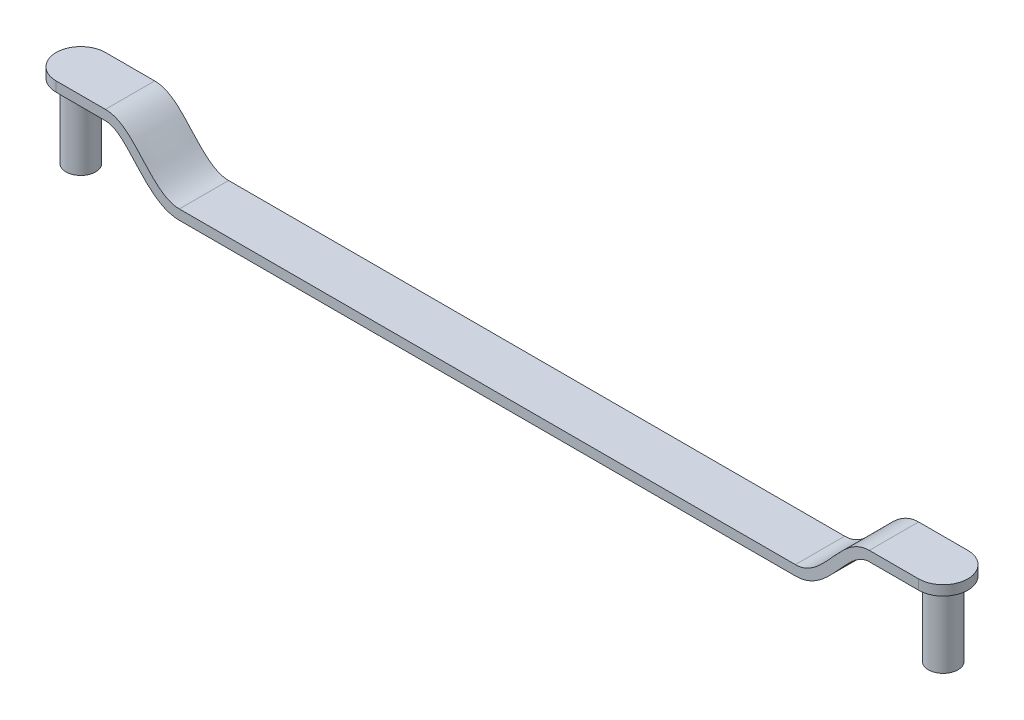
ISO-10303-21;
HEADER;
FILE_DESCRIPTION(('STEP AP214'),'2;1');
FILE_NAME('part.step','',(''),(''),'','','');
FILE_SCHEMA(('AUTOMOTIVE_DESIGN { 1 0 10303 214 1 1 1 1 }'));
ENDSEC;
DATA;
#1=APPLICATION_CONTEXT('core data for automotive mechanical design processes');
#2=APPLICATION_PROTOCOL_DEFINITION('international standard','automotive_design',2000,#1);
#3=PRODUCT_CONTEXT('',#1,'mechanical');
#4=PRODUCT('Part','Part','',(#3));
#5=PRODUCT_RELATED_PRODUCT_CATEGORY('part','',(#4));
#6=PRODUCT_DEFINITION_FORMATION('','',#4);
#7=PRODUCT_DEFINITION_CONTEXT('part definition',#1,'design');
#8=PRODUCT_DEFINITION('design','',#6,#7);
#9=PRODUCT_DEFINITION_SHAPE('','',#8);
#10=(LENGTH_UNIT() NAMED_UNIT(*) SI_UNIT(.MILLI.,.METRE.));
#11=(NAMED_UNIT(*) PLANE_ANGLE_UNIT() SI_UNIT($,.RADIAN.));
#12=(NAMED_UNIT(*) SI_UNIT($,.STERADIAN.) SOLID_ANGLE_UNIT());
#13=UNCERTAINTY_MEASURE_WITH_UNIT(LENGTH_MEASURE(1.E-05),#10,'distance_accuracy_value','');
#14=(GEOMETRIC_REPRESENTATION_CONTEXT(3) GLOBAL_UNCERTAINTY_ASSIGNED_CONTEXT((#13)) GLOBAL_UNIT_ASSIGNED_CONTEXT((#10,
#11,#12)) REPRESENTATION_CONTEXT('',''));
#15=CARTESIAN_POINT('',(0.,0.,0.));
#16=DIRECTION('',(0.,0.,1.));
#17=DIRECTION('',(1.,0.,0.));
#18=AXIS2_PLACEMENT_3D('',#15,#16,#17);
#19=CARTESIAN_POINT('',(-181.368323135879,-36.4831514071302,-50.));
#20=DIRECTION('',(0.,0.,-1.));
#21=DIRECTION('',(-1.,0.,0.));
#22=AXIS2_PLACEMENT_3D('',#19,#20,#21);
#23=PLANE('',#22);
#24=DIRECTION('',(1.,0.,0.));
#25=VECTOR('',#24,1.);
#26=CARTESIAN_POINT('',(-100.,0.,-50.));
#27=LINE('',#26,#25);
#28=CARTESIAN_POINT('',(-100.,0.,-50.));
#29=VERTEX_POINT('',#28);
#30=CARTESIAN_POINT('',(0.,0.,-49.9999999999998));
#31=VERTEX_POINT('',#30);
#32=EDGE_CURVE('E137',#29,#31,#27,.T.);
#33=ORIENTED_EDGE('',*,*,#32,.F.);
#34=CARTESIAN_POINT('',(-250.,-99.9999999999993,-50.));
#35=CARTESIAN_POINT('',(-180.532615562668,-99.9999999999993,-50.));
#36=CARTESIAN_POINT('',(-147.140452079103,0.,-50.));
#37=CARTESIAN_POINT('',(-100.,0.,-50.));
#38=B_SPLINE_CURVE_WITH_KNOTS('',3,(#34,#35,#36,#37),.UNSPECIFIED.,.F.,.F.,(4,4),(0.,1.),.UNSPECIFIED.);
#39=CARTESIAN_POINT('',(-250.,-99.9999999999993,-50.));
#40=VERTEX_POINT('',#39);
#41=EDGE_CURVE('E208',#40,#29,#38,.T.);
#42=ORIENTED_EDGE('',*,*,#41,.F.);
#43=DIRECTION('',(1.,0.,0.));
#44=VECTOR('',#43,1.);
#45=CARTESIAN_POINT('',(-1500.05,-99.9999999999993,-50.));
#46=LINE('',#45,#44);
#47=CARTESIAN_POINT('',(-1500.05,-99.9999999999993,-50.));
#48=VERTEX_POINT('',#47);
#49=EDGE_CURVE('E215',#48,#40,#46,.T.);
#50=ORIENTED_EDGE('',*,*,#49,.F.);
#51=CARTESIAN_POINT('',(-1650.05,0.,-50.));
#52=CARTESIAN_POINT('',(-1602.9095479209,0.,-50.));
#53=CARTESIAN_POINT('',(-1569.51738443733,-99.9999999999993,-50.));
#54=CARTESIAN_POINT('',(-1500.05,-99.9999999999993,-50.));
#55=B_SPLINE_CURVE_WITH_KNOTS('',3,(#51,#52,#53,#54),.UNSPECIFIED.,.F.,.F.,(4,4),(0.,1.),.UNSPECIFIED.);
#56=CARTESIAN_POINT('',(-1650.05,0.,-50.));
#57=VERTEX_POINT('',#56);
#58=EDGE_CURVE('E330',#57,#48,#55,.T.);
#59=ORIENTED_EDGE('',*,*,#58,.F.);
#60=DIRECTION('',(1.,0.,0.));
#61=VECTOR('',#60,1.);
#62=CARTESIAN_POINT('',(-1800.05,0.,-50.));
#63=LINE('',#62,#61);
#64=CARTESIAN_POINT('',(-1750.05,0.,-50.));
#65=VERTEX_POINT('',#64);
#66=EDGE_CURVE('E311',#65,#57,#63,.T.);
#67=ORIENTED_EDGE('',*,*,#66,.F.);
#68=DIRECTION('',(0.,-1.,0.));
#69=VECTOR('',#68,1.);
#70=CARTESIAN_POINT('',(-1750.05,100.,-50.));
#71=LINE('',#70,#69);
#72=CARTESIAN_POINT('',(-1750.05,20.0000000000001,-50.));
#73=VERTEX_POINT('',#72);
#74=EDGE_CURVE('E142',#73,#65,#71,.T.);
#75=ORIENTED_EDGE('',*,*,#74,.F.);
#76=DIRECTION('',(1.,0.,0.));
#77=VECTOR('',#76,1.);
#78=CARTESIAN_POINT('',(-1800.05,20.,-50.));
#79=LINE('',#78,#77);
#80=CARTESIAN_POINT('',(-1650.05,20.,-50.));
#81=VERTEX_POINT('',#80);
#82=EDGE_CURVE('E296',#73,#81,#79,.T.);
#83=ORIENTED_EDGE('',*,*,#82,.T.);
#84=CARTESIAN_POINT('',(-1650.05,20.,-50.));
#85=CARTESIAN_POINT('',(-1647.69297739604,20.,-50.));
#86=CARTESIAN_POINT('',(-1645.36141527148,19.8429598090432,-50.));
#87=CARTESIAN_POINT('',(-1640.79387893537,19.2460441868075,-50.));
#88=CARTESIAN_POINT('',(-1638.55812544507,18.8065476823281,-50.));
#89=CARTESIAN_POINT('',(-1634.20939719985,17.6893726370124,-50.));
#90=CARTESIAN_POINT('',(-1632.09633348562,17.0120303473086,-50.));
#91=CARTESIAN_POINT('',(-1627.99987687242,15.4652101639734,-50.));
#92=CARTESIAN_POINT('',(-1626.01625464293,14.5958919449171,-50.));
#93=CARTESIAN_POINT('',(-1620.2480181844,11.7592268923943,-50.));
#94=CARTESIAN_POINT('',(-1616.64651551086,9.56704665456635,-50.));
#95=CARTESIAN_POINT('',(-1609.79913465099,4.79685776456498,-50.));
#96=CARTESIAN_POINT('',(-1606.55096984895,2.21666230947852,-50.));
#97=CARTESIAN_POINT('',(-1600.27811319094,-3.20589697894512,-50.));
#98=CARTESIAN_POINT('',(-1597.25333634018,-6.04958550715211,-50.));
#99=CARTESIAN_POINT('',(-1591.33464553695,-11.907662628924,-50.));
#100=CARTESIAN_POINT('',(-1588.44105937377,-14.9225545946179,-50.));
#101=CARTESIAN_POINT('',(-1582.72265499064,-21.0374429005578,-50.));
#102=CARTESIAN_POINT('',(-1579.89809247874,-24.1375767172197,-50.));
#103=CARTESIAN_POINT('',(-1574.27613247703,-30.3351804566478,-50.));
#104=CARTESIAN_POINT('',(-1571.47886968136,-33.4326472153403,-50.));
#105=CARTESIAN_POINT('',(-1565.88448404688,-39.5336555989201,-50.));
#106=CARTESIAN_POINT('',(-1563.08741067159,-42.5371227593012,-50.));
#107=CARTESIAN_POINT('',(-1557.47835256378,-48.3567244060529,-50.));
#108=CARTESIAN_POINT('',(-1554.6663841818,-51.1727093849241,-50.));
#109=CARTESIAN_POINT('',(-1549.02369563526,-56.5250959318563,-50.));
#110=CARTESIAN_POINT('',(-1546.19304589148,-59.0612403543102,-50.));
#111=CARTESIAN_POINT('',(-1540.51946642563,-63.768822719616,-50.));
#112=CARTESIAN_POINT('',(-1537.67682601534,-65.9398981335633,-50.));
#113=CARTESIAN_POINT('',(-1531.99139177171,-69.8487568075089,-50.));
#114=CARTESIAN_POINT('',(-1529.14932319721,-71.5862642481918,-50.));
#115=CARTESIAN_POINT('',(-1523.46838481292,-74.5865890554321,-50.));
#116=CARTESIAN_POINT('',(-1520.63061261462,-75.8497675472848,-50.));
#117=CARTESIAN_POINT('',(-1514.92457307281,-77.8884019592618,-50.));
#118=CARTESIAN_POINT('',(-1512.05680505288,-78.6653211487733,-50.));
#119=CARTESIAN_POINT('',(-1506.1912621512,-79.7203339296452,-50.));
#120=CARTESIAN_POINT('',(-1503.19210779951,-79.9999999999993,-50.));
#121=CARTESIAN_POINT('',(-1500.05,-79.9999999999993,-50.));
#122=B_SPLINE_CURVE_WITH_KNOTS('',3,(#84,#85,#86,#87,#88,#89,#90,#91,#92,#93,#94,#95,#96,#97,
#98,#99,#100,#101,#102,#103,#104,#105,#106,#107,#108,#109,#110,#111,#112,#113,#114,#115,#116,
#117,#118,#119,#120,#121),.UNSPECIFIED.,.F.,.F.,(4,2,2,2,2,2,2,2,2,2,2,2,2,2,2,2,2,2,4),(0.,
0.0312499999999987,0.0624999999999975,0.0937499999999962,0.124999999999995,0.187499999999995,
0.249999999999996,0.312499999999996,0.374999999999996,0.437499999999997,0.499999999999997,
0.562499999999997,0.624999999999998,0.687499999999998,0.749999999999999,0.812499999999999,
0.874999999999999,0.9375,1.),.UNSPECIFIED.);
#123=CARTESIAN_POINT('',(-1500.05,-79.9999999999993,-50.));
#124=VERTEX_POINT('',#123);
#125=EDGE_CURVE('E310',#81,#124,#122,.T.);
#126=ORIENTED_EDGE('',*,*,#125,.T.);
#127=DIRECTION('',(1.,0.,0.));
#128=VECTOR('',#127,1.);
#129=CARTESIAN_POINT('',(-1500.05,-79.9999999999993,-50.));
#130=LINE('',#129,#128);
#131=CARTESIAN_POINT('',(-250.,-79.9999999999993,-50.));
#132=VERTEX_POINT('',#131);
#133=EDGE_CURVE('E162',#124,#132,#130,.T.);
#134=ORIENTED_EDGE('',*,*,#133,.T.);
#135=CARTESIAN_POINT('',(-250.,-79.9999999999993,-50.));
#136=CARTESIAN_POINT('',(-246.857892200493,-79.9999999999993,-50.));
#137=CARTESIAN_POINT('',(-243.858737848796,-79.7203339296452,-50.));
#138=CARTESIAN_POINT('',(-237.993194947121,-78.6653211487733,-50.));
#139=CARTESIAN_POINT('',(-235.125426927188,-77.8884019592618,-50.));
#140=CARTESIAN_POINT('',(-229.41938738538,-75.8497675472848,-50.));
#141=CARTESIAN_POINT('',(-226.581615187077,-74.5865890554321,-50.));
#142=CARTESIAN_POINT('',(-220.90067680279,-71.5862642481918,-50.));
#143=CARTESIAN_POINT('',(-218.058608228293,-69.8487568075089,-50.));
#144=CARTESIAN_POINT('',(-212.373173984663,-65.9398981335634,-50.));
#145=CARTESIAN_POINT('',(-209.530533574373,-63.7688227196161,-50.));
#146=CARTESIAN_POINT('',(-203.856954108519,-59.0612403543101,-50.));
#147=CARTESIAN_POINT('',(-201.026304364744,-56.5250959318563,-50.));
#148=CARTESIAN_POINT('',(-195.383615818205,-51.1727093849241,-50.));
#149=CARTESIAN_POINT('',(-192.571647436215,-48.3567244060529,-50.));
#150=CARTESIAN_POINT('',(-186.962589328407,-42.5371227593012,-50.));
#151=CARTESIAN_POINT('',(-184.16551595312,-39.5336555989201,-50.));
#152=CARTESIAN_POINT('',(-178.571130318639,-33.4326472153403,-50.));
#153=CARTESIAN_POINT('',(-175.773867522968,-30.3351804566479,-50.));
#154=CARTESIAN_POINT('',(-170.15190752126,-24.1375767172197,-50.));
#155=CARTESIAN_POINT('',(-167.327345009365,-21.0374429005578,-50.));
#156=CARTESIAN_POINT('',(-161.608940626227,-14.9225545946178,-50.));
#157=CARTESIAN_POINT('',(-158.715354463048,-11.9076626289241,-50.));
#158=CARTESIAN_POINT('',(-152.796663659823,-6.0495855071522,-50.));
#159=CARTESIAN_POINT('',(-149.771886809064,-3.20589697894511,-50.));
#160=CARTESIAN_POINT('',(-143.499030151045,2.21666230947853,-50.));
#161=CARTESIAN_POINT('',(-140.250865349007,4.79685776456493,-50.));
#162=CARTESIAN_POINT('',(-133.403484489137,9.56704665456631,-50.));
#163=CARTESIAN_POINT('',(-129.801981815597,11.7592268923943,-50.));
#164=CARTESIAN_POINT('',(-124.033745357065,14.5958919449171,-50.));
#165=CARTESIAN_POINT('',(-122.050123127582,15.4652101639734,-50.));
#166=CARTESIAN_POINT('',(-117.953666514384,17.0120303473086,-50.));
#167=CARTESIAN_POINT('',(-115.840602800149,17.6893726370124,-50.));
#168=CARTESIAN_POINT('',(-111.491874554925,18.8065476823281,-50.));
#169=CARTESIAN_POINT('',(-109.256121064626,19.2460441868075,-50.));
#170=CARTESIAN_POINT('',(-104.68858472852,19.8429598090432,-50.));
#171=CARTESIAN_POINT('',(-102.357022603955,20.,-50.));
#172=CARTESIAN_POINT('',(-100.,20.,-50.));
#173=B_SPLINE_CURVE_WITH_KNOTS('',3,(#135,#136,#137,#138,#139,#140,#141,#142,#143,#144,#145,
#146,#147,#148,#149,#150,#151,#152,#153,#154,#155,#156,#157,#158,#159,#160,#161,#162,#163,#164,
#165,#166,#167,#168,#169,#170,#171,#172),.UNSPECIFIED.,.F.,.F.,(4,2,2,2,2,2,2,2,2,2,2,2,2,2,2,2,
2,2,4),(0.,0.0624999999999999,0.125,0.1875,0.25,0.3125,0.375,0.4375,0.5,0.5625,0.625,0.6875,
0.75,0.8125,0.875,0.90625,0.9375,0.96875,1.),.UNSPECIFIED.);
#174=CARTESIAN_POINT('',(-100.,20.,-50.));
#175=VERTEX_POINT('',#174);
#176=EDGE_CURVE('E149',#132,#175,#173,.T.);
#177=ORIENTED_EDGE('',*,*,#176,.T.);
#178=DIRECTION('',(1.,0.,0.));
#179=VECTOR('',#178,1.);
#180=CARTESIAN_POINT('',(-100.,20.,-50.));
#181=LINE('',#180,#179);
#182=CARTESIAN_POINT('',(0.,20.0000000000001,-49.9999999999998));
#183=VERTEX_POINT('',#182);
#184=EDGE_CURVE('E140',#175,#183,#181,.T.);
#185=ORIENTED_EDGE('',*,*,#184,.T.);
#186=DIRECTION('',(0.,-1.,0.));
#187=VECTOR('',#186,1.);
#188=CARTESIAN_POINT('',(0.,100.,-49.9999999999998));
#189=LINE('',#188,#187);
#190=EDGE_CURVE('E127',#183,#31,#189,.T.);
#191=ORIENTED_EDGE('',*,*,#190,.T.);
#192=EDGE_LOOP('',(#33,#42,#50,#59,#67,#75,#83,#126,#134,#177,#185,#191));
#193=FACE_BOUND('',#192,.T.);
#194=ADVANCED_FACE('F38',(#193),#23,.T.);
#195=CARTESIAN_POINT('',(-181.368323135879,-36.4831514071302,50.));
#196=DIRECTION('',(0.,0.,-1.));
#197=DIRECTION('',(-1.,0.,0.));
#198=AXIS2_PLACEMENT_3D('',#195,#196,#197);
#199=PLANE('',#198);
#200=DIRECTION('',(1.,0.,0.));
#201=VECTOR('',#200,1.);
#202=CARTESIAN_POINT('',(-100.,20.,50.));
#203=LINE('',#202,#201);
#204=CARTESIAN_POINT('',(-100.,20.,50.));
#205=VERTEX_POINT('',#204);
#206=CARTESIAN_POINT('',(0.,20.,50.));
#207=VERTEX_POINT('',#206);
#208=EDGE_CURVE('E222',#205,#207,#203,.T.);
#209=ORIENTED_EDGE('',*,*,#208,.F.);
#210=CARTESIAN_POINT('',(-250.,-79.9999999999993,50.));
#211=CARTESIAN_POINT('',(-246.857892200493,-79.9999999999993,50.));
#212=CARTESIAN_POINT('',(-243.858737848796,-79.7203339296452,50.));
#213=CARTESIAN_POINT('',(-237.993194947121,-78.6653211487733,50.));
#214=CARTESIAN_POINT('',(-235.125426927188,-77.8884019592618,50.));
#215=CARTESIAN_POINT('',(-229.41938738538,-75.8497675472848,50.));
#216=CARTESIAN_POINT('',(-226.581615187077,-74.5865890554321,50.));
#217=CARTESIAN_POINT('',(-220.90067680279,-71.5862642481918,50.));
#218=CARTESIAN_POINT('',(-218.058608228293,-69.8487568075089,50.));
#219=CARTESIAN_POINT('',(-212.373173984663,-65.9398981335634,50.));
#220=CARTESIAN_POINT('',(-209.530533574373,-63.7688227196161,50.));
#221=CARTESIAN_POINT('',(-203.856954108519,-59.0612403543101,50.));
#222=CARTESIAN_POINT('',(-201.026304364744,-56.5250959318563,50.));
#223=CARTESIAN_POINT('',(-195.383615818205,-51.1727093849241,50.));
#224=CARTESIAN_POINT('',(-192.571647436215,-48.3567244060529,50.));
#225=CARTESIAN_POINT('',(-186.962589328407,-42.5371227593012,50.));
#226=CARTESIAN_POINT('',(-184.16551595312,-39.5336555989201,50.));
#227=CARTESIAN_POINT('',(-178.571130318639,-33.4326472153403,50.));
#228=CARTESIAN_POINT('',(-175.773867522968,-30.3351804566479,50.));
#229=CARTESIAN_POINT('',(-170.15190752126,-24.1375767172197,50.));
#230=CARTESIAN_POINT('',(-167.327345009365,-21.0374429005578,50.));
#231=CARTESIAN_POINT('',(-161.608940626227,-14.9225545946178,50.));
#232=CARTESIAN_POINT('',(-158.715354463048,-11.9076626289241,50.));
#233=CARTESIAN_POINT('',(-152.796663659823,-6.0495855071522,50.));
#234=CARTESIAN_POINT('',(-149.771886809064,-3.20589697894511,50.));
#235=CARTESIAN_POINT('',(-143.499030151045,2.21666230947853,50.));
#236=CARTESIAN_POINT('',(-140.250865349007,4.79685776456493,50.));
#237=CARTESIAN_POINT('',(-133.403484489137,9.56704665456631,50.));
#238=CARTESIAN_POINT('',(-129.801981815597,11.7592268923943,50.));
#239=CARTESIAN_POINT('',(-124.033745357065,14.5958919449171,50.));
#240=CARTESIAN_POINT('',(-122.050123127582,15.4652101639734,50.));
#241=CARTESIAN_POINT('',(-117.953666514384,17.0120303473086,50.));
#242=CARTESIAN_POINT('',(-115.840602800149,17.6893726370124,50.));
#243=CARTESIAN_POINT('',(-111.491874554925,18.8065476823281,50.));
#244=CARTESIAN_POINT('',(-109.256121064626,19.2460441868075,50.));
#245=CARTESIAN_POINT('',(-104.68858472852,19.8429598090432,50.));
#246=CARTESIAN_POINT('',(-102.357022603955,20.,50.));
#247=CARTESIAN_POINT('',(-100.,20.,50.));
#248=B_SPLINE_CURVE_WITH_KNOTS('',3,(#210,#211,#212,#213,#214,#215,#216,#217,#218,#219,#220,
#221,#222,#223,#224,#225,#226,#227,#228,#229,#230,#231,#232,#233,#234,#235,#236,#237,#238,#239,
#240,#241,#242,#243,#244,#245,#246,#247),.UNSPECIFIED.,.F.,.F.,(4,2,2,2,2,2,2,2,2,2,2,2,2,2,2,2,
2,2,4),(0.,0.0624999999999999,0.125,0.1875,0.25,0.3125,0.375,0.4375,0.5,0.5625,0.625,0.6875,
0.75,0.8125,0.875,0.90625,0.9375,0.96875,1.),.UNSPECIFIED.);
#249=CARTESIAN_POINT('',(-250.,-79.9999999999993,50.));
#250=VERTEX_POINT('',#249);
#251=EDGE_CURVE('E225',#250,#205,#248,.T.);
#252=ORIENTED_EDGE('',*,*,#251,.F.);
#253=DIRECTION('',(1.,0.,0.));
#254=VECTOR('',#253,1.);
#255=CARTESIAN_POINT('',(-1500.05,-79.9999999999993,50.));
#256=LINE('',#255,#254);
#257=CARTESIAN_POINT('',(-1500.05,-79.9999999999993,50.));
#258=VERTEX_POINT('',#257);
#259=EDGE_CURVE('E229',#258,#250,#256,.T.);
#260=ORIENTED_EDGE('',*,*,#259,.F.);
#261=CARTESIAN_POINT('',(-1650.05,20.,50.));
#262=CARTESIAN_POINT('',(-1647.69297739604,20.,50.));
#263=CARTESIAN_POINT('',(-1645.36141527148,19.8429598090432,50.));
#264=CARTESIAN_POINT('',(-1640.79387893537,19.2460441868075,50.));
#265=CARTESIAN_POINT('',(-1638.55812544507,18.8065476823281,50.));
#266=CARTESIAN_POINT('',(-1634.20939719985,17.6893726370124,50.));
#267=CARTESIAN_POINT('',(-1632.09633348562,17.0120303473086,50.));
#268=CARTESIAN_POINT('',(-1627.99987687242,15.4652101639734,50.));
#269=CARTESIAN_POINT('',(-1626.01625464293,14.5958919449171,50.));
#270=CARTESIAN_POINT('',(-1620.2480181844,11.7592268923943,50.));
#271=CARTESIAN_POINT('',(-1616.64651551086,9.56704665456635,50.));
#272=CARTESIAN_POINT('',(-1609.79913465099,4.79685776456498,50.));
#273=CARTESIAN_POINT('',(-1606.55096984895,2.21666230947852,50.));
#274=CARTESIAN_POINT('',(-1600.27811319094,-3.20589697894512,50.));
#275=CARTESIAN_POINT('',(-1597.25333634018,-6.04958550715211,50.));
#276=CARTESIAN_POINT('',(-1591.33464553695,-11.907662628924,50.));
#277=CARTESIAN_POINT('',(-1588.44105937377,-14.9225545946179,50.));
#278=CARTESIAN_POINT('',(-1582.72265499064,-21.0374429005578,50.));
#279=CARTESIAN_POINT('',(-1579.89809247874,-24.1375767172197,50.));
#280=CARTESIAN_POINT('',(-1574.27613247703,-30.3351804566478,50.));
#281=CARTESIAN_POINT('',(-1571.47886968136,-33.4326472153403,50.));
#282=CARTESIAN_POINT('',(-1565.88448404688,-39.5336555989201,50.));
#283=CARTESIAN_POINT('',(-1563.08741067159,-42.5371227593012,50.));
#284=CARTESIAN_POINT('',(-1557.47835256378,-48.3567244060529,50.));
#285=CARTESIAN_POINT('',(-1554.6663841818,-51.1727093849241,50.));
#286=CARTESIAN_POINT('',(-1549.02369563526,-56.5250959318563,50.));
#287=CARTESIAN_POINT('',(-1546.19304589148,-59.0612403543102,50.));
#288=CARTESIAN_POINT('',(-1540.51946642563,-63.768822719616,50.));
#289=CARTESIAN_POINT('',(-1537.67682601534,-65.9398981335633,50.));
#290=CARTESIAN_POINT('',(-1531.99139177171,-69.8487568075089,50.));
#291=CARTESIAN_POINT('',(-1529.14932319721,-71.5862642481918,50.));
#292=CARTESIAN_POINT('',(-1523.46838481292,-74.5865890554321,50.));
#293=CARTESIAN_POINT('',(-1520.63061261462,-75.8497675472848,50.));
#294=CARTESIAN_POINT('',(-1514.92457307281,-77.8884019592618,50.));
#295=CARTESIAN_POINT('',(-1512.05680505288,-78.6653211487733,50.));
#296=CARTESIAN_POINT('',(-1506.1912621512,-79.7203339296452,50.));
#297=CARTESIAN_POINT('',(-1503.19210779951,-79.9999999999993,50.));
#298=CARTESIAN_POINT('',(-1500.05,-79.9999999999993,50.));
#299=B_SPLINE_CURVE_WITH_KNOTS('',3,(#261,#262,#263,#264,#265,#266,#267,#268,#269,#270,#271,
#272,#273,#274,#275,#276,#277,#278,#279,#280,#281,#282,#283,#284,#285,#286,#287,#288,#289,#290,
#291,#292,#293,#294,#295,#296,#297,#298),.UNSPECIFIED.,.F.,.F.,(4,2,2,2,2,2,2,2,2,2,2,2,2,2,2,2,
2,2,4),(0.,0.0312499999999987,0.0624999999999975,0.0937499999999962,0.124999999999995,
0.187499999999995,0.249999999999996,0.312499999999996,0.374999999999996,0.437499999999997,
0.499999999999997,0.562499999999997,0.624999999999998,0.687499999999998,0.749999999999999,
0.812499999999999,0.874999999999999,0.9375,1.),.UNSPECIFIED.);
#300=CARTESIAN_POINT('',(-1650.05,20.,50.));
#301=VERTEX_POINT('',#300);
#302=EDGE_CURVE('E234',#301,#258,#299,.T.);
#303=ORIENTED_EDGE('',*,*,#302,.F.);
#304=DIRECTION('',(1.,0.,0.));
#305=VECTOR('',#304,1.);
#306=CARTESIAN_POINT('',(-1800.05,20.,50.));
#307=LINE('',#306,#305);
#308=CARTESIAN_POINT('',(-1750.05,20.0000000000001,50.0000000000002));
#309=VERTEX_POINT('',#308);
#310=EDGE_CURVE('E238',#309,#301,#307,.T.);
#311=ORIENTED_EDGE('',*,*,#310,.F.);
#312=DIRECTION('',(0.,-1.,0.));
#313=VECTOR('',#312,1.);
#314=CARTESIAN_POINT('',(-1750.05,100.,50.));
#315=LINE('',#314,#313);
#316=CARTESIAN_POINT('',(-1750.05,0.,50.));
#317=VERTEX_POINT('',#316);
#318=EDGE_CURVE('E46',#317,#309,#315,.F.);
#319=ORIENTED_EDGE('',*,*,#318,.F.);
#320=DIRECTION('',(1.,0.,0.));
#321=VECTOR('',#320,1.);
#322=CARTESIAN_POINT('',(-1800.05,0.,50.));
#323=LINE('',#322,#321);
#324=CARTESIAN_POINT('',(-1650.05,0.,50.));
#325=VERTEX_POINT('',#324);
#326=EDGE_CURVE('E243',#317,#325,#323,.T.);
#327=ORIENTED_EDGE('',*,*,#326,.T.);
#328=CARTESIAN_POINT('',(-1650.05,0.,50.));
#329=CARTESIAN_POINT('',(-1602.9095479209,0.,50.));
#330=CARTESIAN_POINT('',(-1569.51738443733,-99.9999999999993,50.));
#331=CARTESIAN_POINT('',(-1500.05,-99.9999999999993,50.));
#332=B_SPLINE_CURVE_WITH_KNOTS('',3,(#328,#329,#330,#331),.UNSPECIFIED.,.F.,.F.,(4,4),(0.,1.),.UNSPECIFIED.);
#333=CARTESIAN_POINT('',(-1500.05,-99.9999999999993,50.));
#334=VERTEX_POINT('',#333);
#335=EDGE_CURVE('E245',#325,#334,#332,.T.);
#336=ORIENTED_EDGE('',*,*,#335,.T.);
#337=DIRECTION('',(1.,0.,0.));
#338=VECTOR('',#337,1.);
#339=CARTESIAN_POINT('',(-1500.05,-99.9999999999993,50.));
#340=LINE('',#339,#338);
#341=CARTESIAN_POINT('',(-250.,-99.9999999999993,50.));
#342=VERTEX_POINT('',#341);
#343=EDGE_CURVE('E152',#334,#342,#340,.T.);
#344=ORIENTED_EDGE('',*,*,#343,.T.);
#345=CARTESIAN_POINT('',(-250.,-99.9999999999993,50.));
#346=CARTESIAN_POINT('',(-180.532615562668,-99.9999999999993,50.));
#347=CARTESIAN_POINT('',(-147.140452079103,0.,50.));
#348=CARTESIAN_POINT('',(-100.,0.,50.));
#349=B_SPLINE_CURVE_WITH_KNOTS('',3,(#345,#346,#347,#348),.UNSPECIFIED.,.F.,.F.,(4,4),(0.,1.),.UNSPECIFIED.);
#350=CARTESIAN_POINT('',(-100.,0.,50.));
#351=VERTEX_POINT('',#350);
#352=EDGE_CURVE('E147',#342,#351,#349,.T.);
#353=ORIENTED_EDGE('',*,*,#352,.T.);
#354=DIRECTION('',(1.,0.,0.));
#355=VECTOR('',#354,1.);
#356=CARTESIAN_POINT('',(-100.,0.,50.));
#357=LINE('',#356,#355);
#358=CARTESIAN_POINT('',(0.,0.,49.9999999999998));
#359=VERTEX_POINT('',#358);
#360=EDGE_CURVE('E217',#351,#359,#357,.T.);
#361=ORIENTED_EDGE('',*,*,#360,.T.);
#362=DIRECTION('',(0.,-1.,0.));
#363=VECTOR('',#362,1.);
#364=CARTESIAN_POINT('',(0.,100.,49.9999999999999));
#365=LINE('',#364,#363);
#366=EDGE_CURVE('E12',#359,#207,#365,.F.);
#367=ORIENTED_EDGE('',*,*,#366,.T.);
#368=EDGE_LOOP('',(#209,#252,#260,#303,#311,#319,#327,#336,#344,#353,#361,#367));
#369=FACE_BOUND('',#368,.T.);
#370=ADVANCED_FACE('F189',(#369),#199,.F.);
#371=CARTESIAN_POINT('',(0.,-150.,0.));
#372=DIRECTION('',(0.,1.,0.));
#373=DIRECTION('',(0.,0.,1.));
#374=AXIS2_PLACEMENT_3D('',#371,#372,#373);
#375=CYLINDRICAL_SURFACE('',#374,30.);
#376=CARTESIAN_POINT('',(0.,-150.,0.));
#377=DIRECTION('',(0.,1.,0.));
#378=DIRECTION('',(0.,0.,1.));
#379=AXIS2_PLACEMENT_3D('',#376,#377,#378);
#380=CIRCLE('',#379,30.);
#381=CARTESIAN_POINT('',(0.,-150.,30.));
#382=VERTEX_POINT('',#381);
#383=EDGE_CURVE('E280',#382,#382,#380,.T.);
#384=ORIENTED_EDGE('',*,*,#383,.T.);
#385=EDGE_LOOP('',(#384));
#386=FACE_BOUND('',#385,.T.);
#387=CARTESIAN_POINT('',(0.,0.,0.));
#388=DIRECTION('',(0.,1.,0.));
#389=DIRECTION('',(0.,0.,1.));
#390=AXIS2_PLACEMENT_3D('',#387,#388,#389);
#391=CIRCLE('',#390,30.);
#392=CARTESIAN_POINT('',(0.,0.,30.));
#393=VERTEX_POINT('',#392);
#394=EDGE_CURVE('E261',#393,#393,#391,.T.);
#395=ORIENTED_EDGE('',*,*,#394,.F.);
#396=EDGE_LOOP('',(#395));
#397=FACE_BOUND('',#396,.T.);
#398=ADVANCED_FACE('F40',(#386,#397),#375,.T.);
#399=CARTESIAN_POINT('',(0.,-150.,0.));
#400=DIRECTION('',(0.,1.,0.));
#401=DIRECTION('',(0.,0.,1.));
#402=AXIS2_PLACEMENT_3D('',#399,#400,#401);
#403=PLANE('',#402);
#404=ORIENTED_EDGE('',*,*,#383,.F.);
#405=EDGE_LOOP('',(#404));
#406=FACE_BOUND('',#405,.T.);
#407=ADVANCED_FACE('F182',(#406),#403,.F.);
#408=CARTESIAN_POINT('',(-100.,0.,-50.));
#409=DIRECTION('',(0.,-1.,0.));
#410=DIRECTION('',(0.,0.,-1.));
#411=AXIS2_PLACEMENT_3D('',#408,#409,#410);
#412=PLANE('',#411);
#413=CARTESIAN_POINT('',(0.,0.,0.));
#414=DIRECTION('',(0.,1.,0.));
#415=DIRECTION('',(0.,0.,1.));
#416=AXIS2_PLACEMENT_3D('',#413,#414,#415);
#417=CIRCLE('',#416,49.9999999999998);
#418=EDGE_CURVE('E124',#359,#31,#417,.T.);
#419=ORIENTED_EDGE('',*,*,#418,.F.);
#420=ORIENTED_EDGE('',*,*,#360,.F.);
#421=DIRECTION('',(0.,0.,1.));
#422=VECTOR('',#421,1.);
#423=CARTESIAN_POINT('',(-100.,0.,-50.));
#424=LINE('',#423,#422);
#425=EDGE_CURVE('E146',#29,#351,#424,.T.);
#426=ORIENTED_EDGE('',*,*,#425,.F.);
#427=ORIENTED_EDGE('',*,*,#32,.T.);
#428=EDGE_LOOP('',(#419,#420,#426,#427));
#429=FACE_BOUND('',#428,.T.);
#430=ORIENTED_EDGE('',*,*,#394,.T.);
#431=EDGE_LOOP('',(#430));
#432=FACE_BOUND('',#431,.T.);
#433=ADVANCED_FACE('F144',(#429,#432),#412,.T.);
#434=DIRECTION('',(0.,0.,1.));
#435=VECTOR('',#434,1.);
#436=SURFACE_OF_LINEAR_EXTRUSION('',#38,#435);
#437=ORIENTED_EDGE('',*,*,#352,.F.);
#438=DIRECTION('',(0.,0.,1.));
#439=VECTOR('',#438,1.);
#440=CARTESIAN_POINT('',(-250.,-99.9999999999993,-50.));
#441=LINE('',#440,#439);
#442=EDGE_CURVE('E262',#40,#342,#441,.T.);
#443=ORIENTED_EDGE('',*,*,#442,.F.);
#444=ORIENTED_EDGE('',*,*,#41,.T.);
#445=ORIENTED_EDGE('',*,*,#425,.T.);
#446=EDGE_LOOP('',(#437,#443,#444,#445));
#447=FACE_BOUND('',#446,.T.);
#448=ADVANCED_FACE('F181',(#447),#436,.T.);
#449=CARTESIAN_POINT('',(-1500.05,-99.9999999999993,-50.));
#450=DIRECTION('',(0.,-1.,0.));
#451=DIRECTION('',(0.,0.,-1.));
#452=AXIS2_PLACEMENT_3D('',#449,#450,#451);
#453=PLANE('',#452);
#454=ORIENTED_EDGE('',*,*,#343,.F.);
#455=DIRECTION('',(0.,0.,1.));
#456=VECTOR('',#455,1.);
#457=CARTESIAN_POINT('',(-1500.05,-99.9999999999993,-50.));
#458=LINE('',#457,#456);
#459=EDGE_CURVE('E264',#48,#334,#458,.T.);
#460=ORIENTED_EDGE('',*,*,#459,.F.);
#461=ORIENTED_EDGE('',*,*,#49,.T.);
#462=ORIENTED_EDGE('',*,*,#442,.T.);
#463=EDGE_LOOP('',(#454,#460,#461,#462));
#464=FACE_BOUND('',#463,.T.);
#465=ADVANCED_FACE('F205',(#464),#453,.T.);
#466=DIRECTION('',(0.,0.,1.));
#467=VECTOR('',#466,1.);
#468=SURFACE_OF_LINEAR_EXTRUSION('',#55,#467);
#469=ORIENTED_EDGE('',*,*,#335,.F.);
#470=DIRECTION('',(0.,0.,1.));
#471=VECTOR('',#470,1.);
#472=CARTESIAN_POINT('',(-1650.05,0.,-50.));
#473=LINE('',#472,#471);
#474=EDGE_CURVE('E266',#57,#325,#473,.T.);
#475=ORIENTED_EDGE('',*,*,#474,.F.);
#476=ORIENTED_EDGE('',*,*,#58,.T.);
#477=ORIENTED_EDGE('',*,*,#459,.T.);
#478=EDGE_LOOP('',(#469,#475,#476,#477));
#479=FACE_BOUND('',#478,.T.);
#480=ADVANCED_FACE('F326',(#479),#468,.T.);
#481=CARTESIAN_POINT('',(-1800.05,0.,-50.));
#482=DIRECTION('',(0.,-1.,0.));
#483=DIRECTION('',(0.,0.,-1.));
#484=AXIS2_PLACEMENT_3D('',#481,#482,#483);
#485=PLANE('',#484);
#486=CARTESIAN_POINT('',(-1750.05,0.,0.));
#487=DIRECTION('',(0.,1.,0.));
#488=DIRECTION('',(0.,0.,1.));
#489=AXIS2_PLACEMENT_3D('',#486,#487,#488);
#490=CIRCLE('',#489,50.);
#491=EDGE_CURVE('E53',#65,#317,#490,.T.);
#492=ORIENTED_EDGE('',*,*,#491,.F.);
#493=ORIENTED_EDGE('',*,*,#66,.T.);
#494=ORIENTED_EDGE('',*,*,#474,.T.);
#495=ORIENTED_EDGE('',*,*,#326,.F.);
#496=EDGE_LOOP('',(#492,#493,#494,#495));
#497=FACE_BOUND('',#496,.T.);
#498=CARTESIAN_POINT('',(-1750.05,0.,0.));
#499=DIRECTION('',(0.,-1.,0.));
#500=DIRECTION('',(0.,0.,-1.));
#501=AXIS2_PLACEMENT_3D('',#498,#499,#500);
#502=CIRCLE('',#501,30.);
#503=CARTESIAN_POINT('',(-1750.05,0.,-30.));
#504=VERTEX_POINT('',#503);
#505=EDGE_CURVE('E283',#504,#504,#502,.T.);
#506=ORIENTED_EDGE('',*,*,#505,.F.);
#507=EDGE_LOOP('',(#506));
#508=FACE_BOUND('',#507,.T.);
#509=ADVANCED_FACE('F324',(#497,#508),#485,.T.);
#510=CARTESIAN_POINT('',(-1800.05,20.,-50.));
#511=DIRECTION('',(0.,-1.,0.));
#512=DIRECTION('',(0.,0.,-1.));
#513=AXIS2_PLACEMENT_3D('',#510,#511,#512);
#514=PLANE('',#513);
#515=ORIENTED_EDGE('',*,*,#82,.F.);
#516=CARTESIAN_POINT('',(-1750.05,20.,0.));
#517=DIRECTION('',(0.,-1.,0.));
#518=DIRECTION('',(0.,0.,-1.));
#519=AXIS2_PLACEMENT_3D('',#516,#517,#518);
#520=CIRCLE('',#519,50.);
#521=EDGE_CURVE('E141',#73,#309,#520,.F.);
#522=ORIENTED_EDGE('',*,*,#521,.T.);
#523=ORIENTED_EDGE('',*,*,#310,.T.);
#524=DIRECTION('',(0.,0.,1.));
#525=VECTOR('',#524,1.);
#526=CARTESIAN_POINT('',(-1650.05,20.,-50.));
#527=LINE('',#526,#525);
#528=EDGE_CURVE('E269',#81,#301,#527,.T.);
#529=ORIENTED_EDGE('',*,*,#528,.F.);
#530=EDGE_LOOP('',(#515,#522,#523,#529));
#531=FACE_BOUND('',#530,.T.);
#532=ADVANCED_FACE('F294',(#531),#514,.F.);
#533=DIRECTION('',(0.,0.,1.));
#534=VECTOR('',#533,1.);
#535=SURFACE_OF_LINEAR_EXTRUSION('',#122,#534);
#536=ORIENTED_EDGE('',*,*,#302,.T.);
#537=DIRECTION('',(0.,0.,1.));
#538=VECTOR('',#537,1.);
#539=CARTESIAN_POINT('',(-1500.05,-79.9999999999993,-50.));
#540=LINE('',#539,#538);
#541=EDGE_CURVE('E272',#124,#258,#540,.T.);
#542=ORIENTED_EDGE('',*,*,#541,.F.);
#543=ORIENTED_EDGE('',*,*,#125,.F.);
#544=ORIENTED_EDGE('',*,*,#528,.T.);
#545=EDGE_LOOP('',(#536,#542,#543,#544));
#546=FACE_BOUND('',#545,.T.);
#547=ADVANCED_FACE('F304',(#546),#535,.F.);
#548=CARTESIAN_POINT('',(-1500.05,-79.9999999999993,-50.));
#549=DIRECTION('',(0.,-1.,0.));
#550=DIRECTION('',(0.,0.,-1.));
#551=AXIS2_PLACEMENT_3D('',#548,#549,#550);
#552=PLANE('',#551);
#553=ORIENTED_EDGE('',*,*,#259,.T.);
#554=DIRECTION('',(0.,0.,1.));
#555=VECTOR('',#554,1.);
#556=CARTESIAN_POINT('',(-250.,-79.9999999999993,-50.));
#557=LINE('',#556,#555);
#558=EDGE_CURVE('E275',#132,#250,#557,.T.);
#559=ORIENTED_EDGE('',*,*,#558,.F.);
#560=ORIENTED_EDGE('',*,*,#133,.F.);
#561=ORIENTED_EDGE('',*,*,#541,.T.);
#562=EDGE_LOOP('',(#553,#559,#560,#561));
#563=FACE_BOUND('',#562,.T.);
#564=ADVANCED_FACE('F173',(#563),#552,.F.);
#565=DIRECTION('',(0.,0.,1.));
#566=VECTOR('',#565,1.);
#567=SURFACE_OF_LINEAR_EXTRUSION('',#173,#566);
#568=ORIENTED_EDGE('',*,*,#251,.T.);
#569=DIRECTION('',(0.,0.,1.));
#570=VECTOR('',#569,1.);
#571=CARTESIAN_POINT('',(-100.,20.,-50.));
#572=LINE('',#571,#570);
#573=EDGE_CURVE('E214',#175,#205,#572,.T.);
#574=ORIENTED_EDGE('',*,*,#573,.F.);
#575=ORIENTED_EDGE('',*,*,#176,.F.);
#576=ORIENTED_EDGE('',*,*,#558,.T.);
#577=EDGE_LOOP('',(#568,#574,#575,#576));
#578=FACE_BOUND('',#577,.T.);
#579=ADVANCED_FACE('F168',(#578),#567,.F.);
#580=CARTESIAN_POINT('',(-100.,20.,-50.));
#581=DIRECTION('',(0.,-1.,0.));
#582=DIRECTION('',(0.,0.,-1.));
#583=AXIS2_PLACEMENT_3D('',#580,#581,#582);
#584=PLANE('',#583);
#585=ORIENTED_EDGE('',*,*,#208,.T.);
#586=CARTESIAN_POINT('',(0.,20.,0.));
#587=DIRECTION('',(0.,-1.,0.));
#588=DIRECTION('',(0.,0.,-1.));
#589=AXIS2_PLACEMENT_3D('',#586,#587,#588);
#590=CIRCLE('',#589,49.9999999999998);
#591=EDGE_CURVE('E61',#207,#183,#590,.F.);
#592=ORIENTED_EDGE('',*,*,#591,.T.);
#593=ORIENTED_EDGE('',*,*,#184,.F.);
#594=ORIENTED_EDGE('',*,*,#573,.T.);
#595=EDGE_LOOP('',(#585,#592,#593,#594));
#596=FACE_BOUND('',#595,.T.);
#597=ADVANCED_FACE('F172',(#596),#584,.F.);
#598=CARTESIAN_POINT('',(-1750.05,-150.,0.));
#599=DIRECTION('',(0.,1.,0.));
#600=DIRECTION('',(0.,0.,1.));
#601=AXIS2_PLACEMENT_3D('',#598,#599,#600);
#602=CYLINDRICAL_SURFACE('',#601,30.);
#603=CARTESIAN_POINT('',(-1750.05,-150.,0.));
#604=DIRECTION('',(0.,1.,0.));
#605=DIRECTION('',(0.,0.,1.));
#606=AXIS2_PLACEMENT_3D('',#603,#604,#605);
#607=CIRCLE('',#606,30.);
#608=CARTESIAN_POINT('',(-1750.05,-150.,30.));
#609=VERTEX_POINT('',#608);
#610=EDGE_CURVE('E155',#609,#609,#607,.T.);
#611=ORIENTED_EDGE('',*,*,#610,.T.);
#612=EDGE_LOOP('',(#611));
#613=FACE_BOUND('',#612,.T.);
#614=ORIENTED_EDGE('',*,*,#505,.T.);
#615=EDGE_LOOP('',(#614));
#616=FACE_BOUND('',#615,.T.);
#617=ADVANCED_FACE('F178',(#613,#616),#602,.T.);
#618=CARTESIAN_POINT('',(-1750.05,-150.,0.));
#619=DIRECTION('',(0.,1.,0.));
#620=DIRECTION('',(0.,0.,1.));
#621=AXIS2_PLACEMENT_3D('',#618,#619,#620);
#622=PLANE('',#621);
#623=ORIENTED_EDGE('',*,*,#610,.F.);
#624=EDGE_LOOP('',(#623));
#625=FACE_BOUND('',#624,.T.);
#626=ADVANCED_FACE('F356',(#625),#622,.F.);
#627=CARTESIAN_POINT('',(-1750.05,100.,0.));
#628=DIRECTION('',(0.,-1.,0.));
#629=DIRECTION('',(0.,0.,-1.));
#630=AXIS2_PLACEMENT_3D('',#627,#628,#629);
#631=CYLINDRICAL_SURFACE('',#630,50.);
#632=ORIENTED_EDGE('',*,*,#491,.T.);
#633=ORIENTED_EDGE('',*,*,#318,.T.);
#634=ORIENTED_EDGE('',*,*,#521,.F.);
#635=ORIENTED_EDGE('',*,*,#74,.T.);
#636=EDGE_LOOP('',(#632,#633,#634,#635));
#637=FACE_BOUND('',#636,.T.);
#638=ADVANCED_FACE('F288',(#637),#631,.T.);
#639=CARTESIAN_POINT('',(0.,100.,0.));
#640=DIRECTION('',(0.,-1.,0.));
#641=DIRECTION('',(0.,0.,-1.));
#642=AXIS2_PLACEMENT_3D('',#639,#640,#641);
#643=CYLINDRICAL_SURFACE('',#642,49.9999999999998);
#644=ORIENTED_EDGE('',*,*,#366,.F.);
#645=ORIENTED_EDGE('',*,*,#418,.T.);
#646=ORIENTED_EDGE('',*,*,#190,.F.);
#647=ORIENTED_EDGE('',*,*,#591,.F.);
#648=EDGE_LOOP('',(#644,#645,#646,#647));
#649=FACE_BOUND('',#648,.T.);
#650=ADVANCED_FACE('F126',(#649),#643,.T.);
#651=CLOSED_SHELL('',(#194,#370,#398,#407,#433,#448,#465,#480,#509,#532,#547,#564,#579,#597,
#617,#626,#638,#650));
#652=MANIFOLD_SOLID_BREP('B2',#651);
#653=ADVANCED_BREP_SHAPE_REPRESENTATION('',(#18,#652),#14);
#654=SHAPE_DEFINITION_REPRESENTATION(#9,#653);
ENDSEC;
END-ISO-10303-21;
